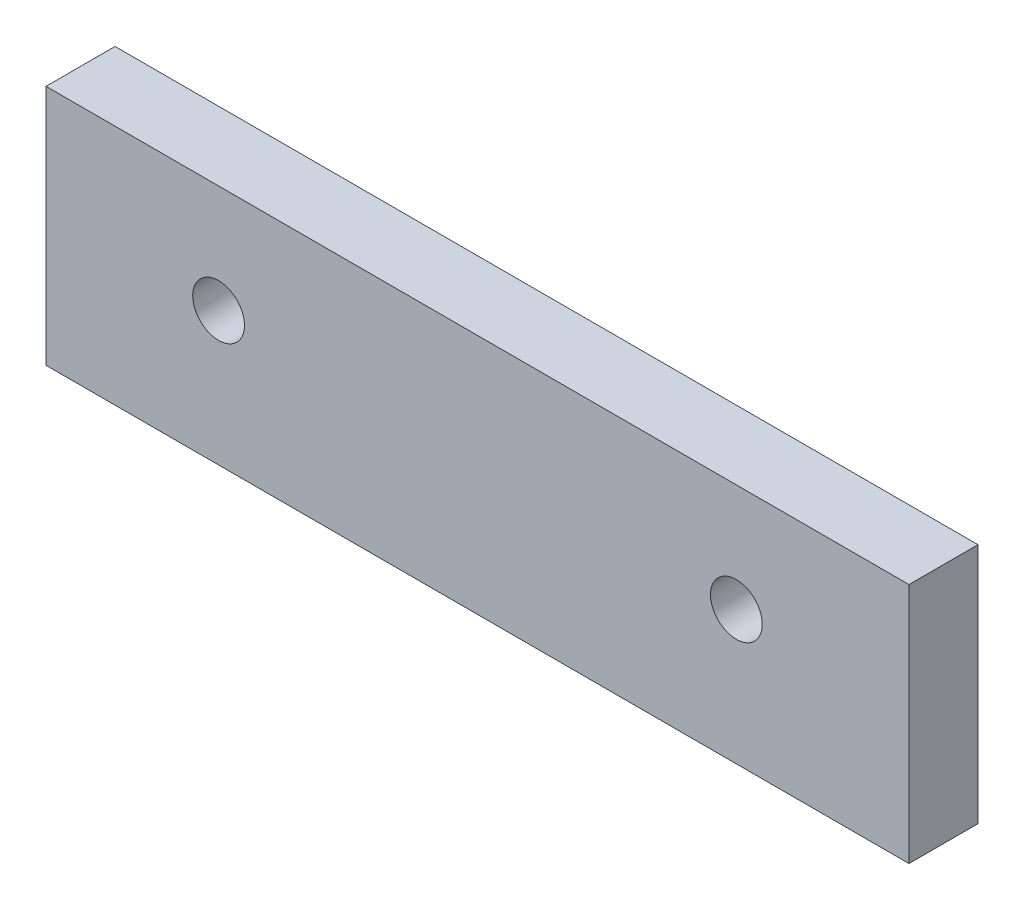
ISO-10303-21;
HEADER;
FILE_DESCRIPTION(('STEP AP214'),'2;1');
FILE_NAME('part.step','',(''),(''),'','','');
FILE_SCHEMA(('AUTOMOTIVE_DESIGN { 1 0 10303 214 1 1 1 1 }'));
ENDSEC;
DATA;
#1=APPLICATION_CONTEXT('core data for automotive mechanical design processes');
#2=APPLICATION_PROTOCOL_DEFINITION('international standard','automotive_design',2000,#1);
#3=PRODUCT_CONTEXT('',#1,'mechanical');
#4=PRODUCT('Part','Part','',(#3));
#5=PRODUCT_RELATED_PRODUCT_CATEGORY('part','',(#4));
#6=PRODUCT_DEFINITION_FORMATION('','',#4);
#7=PRODUCT_DEFINITION_CONTEXT('part definition',#1,'design');
#8=PRODUCT_DEFINITION('design','',#6,#7);
#9=PRODUCT_DEFINITION_SHAPE('','',#8);
#10=(LENGTH_UNIT() NAMED_UNIT(*) SI_UNIT(.MILLI.,.METRE.));
#11=(NAMED_UNIT(*) PLANE_ANGLE_UNIT() SI_UNIT($,.RADIAN.));
#12=(NAMED_UNIT(*) SI_UNIT($,.STERADIAN.) SOLID_ANGLE_UNIT());
#13=UNCERTAINTY_MEASURE_WITH_UNIT(LENGTH_MEASURE(1.E-05),#10,'distance_accuracy_value','');
#14=(GEOMETRIC_REPRESENTATION_CONTEXT(3) GLOBAL_UNCERTAINTY_ASSIGNED_CONTEXT((#13)) GLOBAL_UNIT_ASSIGNED_CONTEXT((#10,
#11,#12)) REPRESENTATION_CONTEXT('',''));
#15=CARTESIAN_POINT('',(0.,0.,0.));
#16=DIRECTION('',(0.,0.,1.));
#17=DIRECTION('',(1.,0.,0.));
#18=AXIS2_PLACEMENT_3D('',#15,#16,#17);
#19=CARTESIAN_POINT('',(50.,14.,7.99999999999999));
#20=DIRECTION('',(-1.,0.,0.));
#21=DIRECTION('',(0.,0.,0.999999999999999));
#22=AXIS2_PLACEMENT_3D('',#19,#20,#21);
#23=PLANE('',#22);
#24=DIRECTION('',(0.,1.,0.));
#25=VECTOR('',#24,1.);
#26=CARTESIAN_POINT('',(50.,14.,0.));
#27=LINE('',#26,#25);
#28=CARTESIAN_POINT('',(50.,-14.,0.));
#29=VERTEX_POINT('',#28);
#30=CARTESIAN_POINT('',(50.,14.,0.));
#31=VERTEX_POINT('',#30);
#32=EDGE_CURVE('E121',#29,#31,#27,.T.);
#33=ORIENTED_EDGE('',*,*,#32,.T.);
#34=DIRECTION('',(0.,0.,-0.999999999999999));
#35=VECTOR('',#34,1.);
#36=CARTESIAN_POINT('',(50.,14.,7.99999999999999));
#37=LINE('',#36,#35);
#38=CARTESIAN_POINT('',(50.,14.,7.99999999999999));
#39=VERTEX_POINT('',#38);
#40=EDGE_CURVE('E13',#39,#31,#37,.T.);
#41=ORIENTED_EDGE('',*,*,#40,.F.);
#42=DIRECTION('',(0.,1.,0.));
#43=VECTOR('',#42,1.);
#44=CARTESIAN_POINT('',(50.,14.,7.99999999999999));
#45=LINE('',#44,#43);
#46=CARTESIAN_POINT('',(50.,-14.,7.99999999999999));
#47=VERTEX_POINT('',#46);
#48=EDGE_CURVE('E104',#47,#39,#45,.T.);
#49=ORIENTED_EDGE('',*,*,#48,.F.);
#50=DIRECTION('',(0.,0.,-0.999999999999999));
#51=VECTOR('',#50,1.);
#52=CARTESIAN_POINT('',(50.,-14.,7.99999999999999));
#53=LINE('',#52,#51);
#54=EDGE_CURVE('E117',#47,#29,#53,.T.);
#55=ORIENTED_EDGE('',*,*,#54,.T.);
#56=EDGE_LOOP('',(#33,#41,#49,#55));
#57=FACE_BOUND('',#56,.T.);
#58=ADVANCED_FACE('F52',(#57),#23,.F.);
#59=CARTESIAN_POINT('',(-50.,14.,7.99999999999998));
#60=DIRECTION('',(0.,-1.,0.));
#61=DIRECTION('',(0.,0.,-0.999999999999999));
#62=AXIS2_PLACEMENT_3D('',#59,#60,#61);
#63=PLANE('',#62);
#64=DIRECTION('',(-1.,0.,0.));
#65=VECTOR('',#64,1.);
#66=CARTESIAN_POINT('',(-50.,14.,0.));
#67=LINE('',#66,#65);
#68=CARTESIAN_POINT('',(-50.,14.,0.));
#69=VERTEX_POINT('',#68);
#70=EDGE_CURVE('E109',#31,#69,#67,.T.);
#71=ORIENTED_EDGE('',*,*,#70,.T.);
#72=DIRECTION('',(0.,0.,-0.999999999999999));
#73=VECTOR('',#72,1.);
#74=CARTESIAN_POINT('',(-50.,14.,7.99999999999998));
#75=LINE('',#74,#73);
#76=CARTESIAN_POINT('',(-50.,14.,7.99999999999998));
#77=VERTEX_POINT('',#76);
#78=EDGE_CURVE('E61',#77,#69,#75,.T.);
#79=ORIENTED_EDGE('',*,*,#78,.F.);
#80=DIRECTION('',(-1.,0.,0.));
#81=VECTOR('',#80,1.);
#82=CARTESIAN_POINT('',(-50.,14.,7.99999999999998));
#83=LINE('',#82,#81);
#84=EDGE_CURVE('E99',#39,#77,#83,.T.);
#85=ORIENTED_EDGE('',*,*,#84,.F.);
#86=ORIENTED_EDGE('',*,*,#40,.T.);
#87=EDGE_LOOP('',(#71,#79,#85,#86));
#88=FACE_BOUND('',#87,.T.);
#89=ADVANCED_FACE('F108',(#88),#63,.F.);
#90=CARTESIAN_POINT('',(-50.,14.,7.99999999999998));
#91=DIRECTION('',(1.,0.,0.));
#92=DIRECTION('',(0.,0.,-0.999999999999999));
#93=AXIS2_PLACEMENT_3D('',#90,#91,#92);
#94=PLANE('',#93);
#95=DIRECTION('',(0.,-1.,0.));
#96=VECTOR('',#95,1.);
#97=CARTESIAN_POINT('',(-50.,14.,0.));
#98=LINE('',#97,#96);
#99=CARTESIAN_POINT('',(-50.,-14.,0.));
#100=VERTEX_POINT('',#99);
#101=EDGE_CURVE('E86',#69,#100,#98,.T.);
#102=ORIENTED_EDGE('',*,*,#101,.T.);
#103=DIRECTION('',(0.,0.,-0.999999999999999));
#104=VECTOR('',#103,1.);
#105=CARTESIAN_POINT('',(-50.,-14.,7.99999999999999));
#106=LINE('',#105,#104);
#107=CARTESIAN_POINT('',(-50.,-14.,7.99999999999999));
#108=VERTEX_POINT('',#107);
#109=EDGE_CURVE('E111',#108,#100,#106,.T.);
#110=ORIENTED_EDGE('',*,*,#109,.F.);
#111=DIRECTION('',(0.,-1.,0.));
#112=VECTOR('',#111,1.);
#113=CARTESIAN_POINT('',(-50.,14.,7.99999999999998));
#114=LINE('',#113,#112);
#115=EDGE_CURVE('E102',#77,#108,#114,.T.);
#116=ORIENTED_EDGE('',*,*,#115,.F.);
#117=ORIENTED_EDGE('',*,*,#78,.T.);
#118=EDGE_LOOP('',(#102,#110,#116,#117));
#119=FACE_BOUND('',#118,.T.);
#120=ADVANCED_FACE('F112',(#119),#94,.F.);
#121=CARTESIAN_POINT('',(-50.,-14.,7.99999999999999));
#122=DIRECTION('',(0.,1.,0.));
#123=DIRECTION('',(0.,0.,0.999999999999999));
#124=AXIS2_PLACEMENT_3D('',#121,#122,#123);
#125=PLANE('',#124);
#126=DIRECTION('',(1.,0.,0.));
#127=VECTOR('',#126,1.);
#128=CARTESIAN_POINT('',(-50.,-14.,0.));
#129=LINE('',#128,#127);
#130=EDGE_CURVE('E92',#100,#29,#129,.T.);
#131=ORIENTED_EDGE('',*,*,#130,.T.);
#132=ORIENTED_EDGE('',*,*,#54,.F.);
#133=DIRECTION('',(1.,0.,0.));
#134=VECTOR('',#133,1.);
#135=CARTESIAN_POINT('',(-50.,-14.,7.99999999999999));
#136=LINE('',#135,#134);
#137=EDGE_CURVE('E69',#108,#47,#136,.T.);
#138=ORIENTED_EDGE('',*,*,#137,.F.);
#139=ORIENTED_EDGE('',*,*,#109,.T.);
#140=EDGE_LOOP('',(#131,#132,#138,#139));
#141=FACE_BOUND('',#140,.T.);
#142=ADVANCED_FACE('F136',(#141),#125,.F.);
#143=CARTESIAN_POINT('',(0.,0.,7.99999999999999));
#144=DIRECTION('',(0.,0.,0.999999999999999));
#145=DIRECTION('',(1.,0.,0.));
#146=AXIS2_PLACEMENT_3D('',#143,#144,#145);
#147=PLANE('',#146);
#148=CARTESIAN_POINT('',(-30.,1.50000000000006,7.99999999999999));
#149=DIRECTION('',(0.,0.,-0.999999999999999));
#150=DIRECTION('',(-1.,0.,0.));
#151=AXIS2_PLACEMENT_3D('',#148,#149,#150);
#152=CIRCLE('',#151,3.);
#153=CARTESIAN_POINT('',(-33.,1.50000000000006,7.99999999999999));
#154=VERTEX_POINT('',#153);
#155=EDGE_CURVE('E155',#154,#154,#152,.T.);
#156=ORIENTED_EDGE('',*,*,#155,.T.);
#157=EDGE_LOOP('',(#156));
#158=FACE_BOUND('',#157,.T.);
#159=CARTESIAN_POINT('',(30.,1.50000000000006,7.99999999999999));
#160=DIRECTION('',(0.,0.,-0.999999999999999));
#161=DIRECTION('',(-1.,0.,0.));
#162=AXIS2_PLACEMENT_3D('',#159,#160,#161);
#163=CIRCLE('',#162,3.);
#164=CARTESIAN_POINT('',(27.,1.50000000000006,7.99999999999999));
#165=VERTEX_POINT('',#164);
#166=EDGE_CURVE('E125',#165,#165,#163,.T.);
#167=ORIENTED_EDGE('',*,*,#166,.T.);
#168=EDGE_LOOP('',(#167));
#169=FACE_BOUND('',#168,.T.);
#170=ORIENTED_EDGE('',*,*,#48,.T.);
#171=ORIENTED_EDGE('',*,*,#84,.T.);
#172=ORIENTED_EDGE('',*,*,#115,.T.);
#173=ORIENTED_EDGE('',*,*,#137,.T.);
#174=EDGE_LOOP('',(#170,#171,#172,#173));
#175=FACE_BOUND('',#174,.T.);
#176=ADVANCED_FACE('F100',(#158,#169,#175),#147,.T.);
#177=CARTESIAN_POINT('',(0.,0.,0.));
#178=DIRECTION('',(0.,0.,0.999999999999999));
#179=DIRECTION('',(1.,0.,0.));
#180=AXIS2_PLACEMENT_3D('',#177,#178,#179);
#181=PLANE('',#180);
#182=CARTESIAN_POINT('',(-30.,1.50000000000006,0.));
#183=DIRECTION('',(0.,0.,-0.999999999999999));
#184=DIRECTION('',(-1.,0.,0.));
#185=AXIS2_PLACEMENT_3D('',#182,#183,#184);
#186=CIRCLE('',#185,6.);
#187=CARTESIAN_POINT('',(-36.,1.50000000000006,0.));
#188=VERTEX_POINT('',#187);
#189=EDGE_CURVE('E163',#188,#188,#186,.T.);
#190=ORIENTED_EDGE('',*,*,#189,.F.);
#191=EDGE_LOOP('',(#190));
#192=FACE_BOUND('',#191,.T.);
#193=CARTESIAN_POINT('',(30.,1.50000000000006,0.));
#194=DIRECTION('',(0.,0.,-0.999999999999999));
#195=DIRECTION('',(-1.,0.,0.));
#196=AXIS2_PLACEMENT_3D('',#193,#194,#195);
#197=CIRCLE('',#196,6.);
#198=CARTESIAN_POINT('',(24.,1.50000000000006,0.));
#199=VERTEX_POINT('',#198);
#200=EDGE_CURVE('E151',#199,#199,#197,.T.);
#201=ORIENTED_EDGE('',*,*,#200,.F.);
#202=EDGE_LOOP('',(#201));
#203=FACE_BOUND('',#202,.T.);
#204=ORIENTED_EDGE('',*,*,#32,.F.);
#205=ORIENTED_EDGE('',*,*,#130,.F.);
#206=ORIENTED_EDGE('',*,*,#101,.F.);
#207=ORIENTED_EDGE('',*,*,#70,.F.);
#208=EDGE_LOOP('',(#204,#205,#206,#207));
#209=FACE_BOUND('',#208,.T.);
#210=ADVANCED_FACE('F139',(#192,#203,#209),#181,.F.);
#211=CARTESIAN_POINT('',(30.,1.50000000000006,0.));
#212=DIRECTION('',(0.,0.,-0.999999999999999));
#213=DIRECTION('',(-1.,0.,0.));
#214=AXIS2_PLACEMENT_3D('',#211,#212,#213);
#215=CYLINDRICAL_SURFACE('',#214,3.);
#216=CARTESIAN_POINT('',(30.,1.50000000000006,3.));
#217=DIRECTION('',(0.,0.,-0.999999999999999));
#218=DIRECTION('',(-1.,0.,0.));
#219=AXIS2_PLACEMENT_3D('',#216,#217,#218);
#220=CIRCLE('',#219,3.);
#221=CARTESIAN_POINT('',(27.,1.50000000000006,3.));
#222=VERTEX_POINT('',#221);
#223=EDGE_CURVE('E147',#222,#222,#220,.T.);
#224=CARTESIAN_POINT('',(27.,1.50000000000006,7.99999999999999));
#225=CARTESIAN_POINT('',(27.,1.50000000000006,7.94791666666666));
#226=CARTESIAN_POINT('',(27.,1.50000000000006,7.89583333333333));
#227=CARTESIAN_POINT('',(27.,1.50000000000006,7.79166666666666));
#228=CARTESIAN_POINT('',(27.,1.50000000000006,7.73958333333333));
#229=CARTESIAN_POINT('',(27.,1.50000000000006,7.63541666666666));
#230=CARTESIAN_POINT('',(27.,1.50000000000006,7.58333333333333));
#231=CARTESIAN_POINT('',(27.,1.50000000000006,7.47916666666666));
#232=CARTESIAN_POINT('',(27.,1.50000000000006,7.42708333333333));
#233=CARTESIAN_POINT('',(27.,1.50000000000006,7.32291666666666));
#234=CARTESIAN_POINT('',(27.,1.50000000000006,7.27083333333333));
#235=CARTESIAN_POINT('',(27.,1.50000000000006,7.16666666666666));
#236=CARTESIAN_POINT('',(27.,1.50000000000006,7.11458333333333));
#237=CARTESIAN_POINT('',(27.,1.50000000000006,7.01041666666666));
#238=CARTESIAN_POINT('',(27.,1.50000000000006,6.95833333333333));
#239=CARTESIAN_POINT('',(27.,1.50000000000006,6.85416666666666));
#240=CARTESIAN_POINT('',(27.,1.50000000000006,6.80208333333333));
#241=CARTESIAN_POINT('',(27.,1.50000000000006,6.69791666666666));
#242=CARTESIAN_POINT('',(27.,1.50000000000006,6.64583333333333));
#243=CARTESIAN_POINT('',(27.,1.50000000000006,6.54166666666666));
#244=CARTESIAN_POINT('',(27.,1.50000000000006,6.48958333333333));
#245=CARTESIAN_POINT('',(27.,1.50000000000006,6.38541666666666));
#246=CARTESIAN_POINT('',(27.,1.50000000000006,6.33333333333333));
#247=CARTESIAN_POINT('',(27.,1.50000000000006,6.22916666666666));
#248=CARTESIAN_POINT('',(27.,1.50000000000006,6.17708333333333));
#249=CARTESIAN_POINT('',(27.,1.50000000000006,6.07291666666666));
#250=CARTESIAN_POINT('',(27.,1.50000000000006,6.02083333333333));
#251=CARTESIAN_POINT('',(27.,1.50000000000006,5.91666666666666));
#252=CARTESIAN_POINT('',(27.,1.50000000000006,5.86458333333333));
#253=CARTESIAN_POINT('',(27.,1.50000000000006,5.76041666666666));
#254=CARTESIAN_POINT('',(27.,1.50000000000006,5.70833333333333));
#255=CARTESIAN_POINT('',(27.,1.50000000000006,5.60416666666666));
#256=CARTESIAN_POINT('',(27.,1.50000000000006,5.55208333333333));
#257=CARTESIAN_POINT('',(27.,1.50000000000006,5.44791666666667));
#258=CARTESIAN_POINT('',(27.,1.50000000000006,5.39583333333333));
#259=CARTESIAN_POINT('',(27.,1.50000000000006,5.29166666666667));
#260=CARTESIAN_POINT('',(27.,1.50000000000006,5.23958333333333));
#261=CARTESIAN_POINT('',(27.,1.50000000000006,5.13541666666667));
#262=CARTESIAN_POINT('',(27.,1.50000000000006,5.08333333333333));
#263=CARTESIAN_POINT('',(27.,1.50000000000006,4.97916666666667));
#264=CARTESIAN_POINT('',(27.,1.50000000000006,4.92708333333333));
#265=CARTESIAN_POINT('',(27.,1.50000000000006,4.82291666666667));
#266=CARTESIAN_POINT('',(27.,1.50000000000006,4.77083333333333));
#267=CARTESIAN_POINT('',(27.,1.50000000000006,4.66666666666667));
#268=CARTESIAN_POINT('',(27.,1.50000000000006,4.61458333333333));
#269=CARTESIAN_POINT('',(27.,1.50000000000006,4.51041666666667));
#270=CARTESIAN_POINT('',(27.,1.50000000000006,4.45833333333333));
#271=CARTESIAN_POINT('',(27.,1.50000000000006,4.35416666666667));
#272=CARTESIAN_POINT('',(27.,1.50000000000006,4.30208333333333));
#273=CARTESIAN_POINT('',(27.,1.50000000000006,4.19791666666667));
#274=CARTESIAN_POINT('',(27.,1.50000000000006,4.14583333333333));
#275=CARTESIAN_POINT('',(27.,1.50000000000006,4.04166666666667));
#276=CARTESIAN_POINT('',(27.,1.50000000000006,3.98958333333333));
#277=CARTESIAN_POINT('',(27.,1.50000000000006,3.88541666666667));
#278=CARTESIAN_POINT('',(27.,1.50000000000006,3.83333333333333));
#279=CARTESIAN_POINT('',(27.,1.50000000000006,3.72916666666667));
#280=CARTESIAN_POINT('',(27.,1.50000000000006,3.67708333333334));
#281=CARTESIAN_POINT('',(27.,1.50000000000006,3.57291666666667));
#282=CARTESIAN_POINT('',(27.,1.50000000000006,3.52083333333333));
#283=CARTESIAN_POINT('',(27.,1.50000000000006,3.41666666666667));
#284=CARTESIAN_POINT('',(27.,1.50000000000006,3.36458333333334));
#285=CARTESIAN_POINT('',(27.,1.50000000000006,3.26041666666667));
#286=CARTESIAN_POINT('',(27.,1.50000000000006,3.20833333333334));
#287=CARTESIAN_POINT('',(27.,1.50000000000006,3.10416666666667));
#288=CARTESIAN_POINT('',(27.,1.50000000000006,3.05208333333334));
#289=CARTESIAN_POINT('',(27.,1.50000000000006,3.));
#290=B_SPLINE_CURVE_WITH_KNOTS('',3,(#224,#225,#226,#227,#228,#229,#230,#231,#232,#233,#234,
#235,#236,#237,#238,#239,#240,#241,#242,#243,#244,#245,#246,#247,#248,#249,#250,#251,#252,#253,
#254,#255,#256,#257,#258,#259,#260,#261,#262,#263,#264,#265,#266,#267,#268,#269,#270,#271,#272,
#273,#274,#275,#276,#277,#278,#279,#280,#281,#282,#283,#284,#285,#286,#287,#288,#289),
.UNSPECIFIED.,.F.,.F.,(4,2,2,2,2,2,2,2,2,2,2,2,2,2,2,2,2,2,2,2,2,2,2,2,2,2,2,2,2,2,2,2,4),(0.,
0.15625,0.312499999999999,0.46875,0.624999999999999,0.781249999999999,0.937499999999998,1.09375,
1.25,1.40625,1.5625,1.71875,1.875,2.03125,2.1875,2.34375,2.5,2.65624999999999,2.81249999999999,
2.96874999999999,3.12499999999999,3.28124999999999,3.43749999999999,3.59374999999999,
3.74999999999999,3.90624999999999,4.06249999999999,4.21874999999999,4.37499999999999,
4.53124999999999,4.68749999999999,4.84374999999999,4.99999999999999),.UNSPECIFIED.);
#291=EDGE_CURVE('BSEAM173',#165,#222,#290,.T.);
#292=ORIENTED_EDGE('',*,*,#166,.F.);
#293=ORIENTED_EDGE('',*,*,#223,.T.);
#294=ORIENTED_EDGE('',*,*,#291,.T.);
#295=ORIENTED_EDGE('',*,*,#291,.F.);
#296=EDGE_LOOP('',(#292,#294,#293,#295));
#297=FACE_BOUND('',#296,.T.);
#298=ADVANCED_FACE('F173',(#297),#215,.F.);
#299=CARTESIAN_POINT('',(30.,1.50000000000006,0.));
#300=DIRECTION('',(0.,0.,-0.999999999999999));
#301=DIRECTION('',(-1.,0.,0.));
#302=AXIS2_PLACEMENT_3D('',#299,#300,#301);
#303=CONICAL_SURFACE('',#302,6.,0.785398163397449);
#304=CARTESIAN_POINT('',(27.,1.50000000000006,3.));
#305=CARTESIAN_POINT('',(26.96875,1.50000000000006,2.96875));
#306=CARTESIAN_POINT('',(26.9375,1.50000000000006,2.9375));
#307=CARTESIAN_POINT('',(26.875,1.50000000000006,2.875));
#308=CARTESIAN_POINT('',(26.84375,1.50000000000006,2.84375));
#309=CARTESIAN_POINT('',(26.78125,1.50000000000006,2.78125));
#310=CARTESIAN_POINT('',(26.75,1.50000000000006,2.75));
#311=CARTESIAN_POINT('',(26.6875,1.50000000000006,2.6875));
#312=CARTESIAN_POINT('',(26.65625,1.50000000000006,2.65625));
#313=CARTESIAN_POINT('',(26.59375,1.50000000000006,2.59375));
#314=CARTESIAN_POINT('',(26.5625,1.50000000000006,2.5625));
#315=CARTESIAN_POINT('',(26.5,1.50000000000006,2.5));
#316=CARTESIAN_POINT('',(26.46875,1.50000000000006,2.46875));
#317=CARTESIAN_POINT('',(26.40625,1.50000000000006,2.40625));
#318=CARTESIAN_POINT('',(26.375,1.50000000000006,2.375));
#319=CARTESIAN_POINT('',(26.3125,1.50000000000006,2.3125));
#320=CARTESIAN_POINT('',(26.28125,1.50000000000006,2.28125));
#321=CARTESIAN_POINT('',(26.21875,1.50000000000006,2.21875));
#322=CARTESIAN_POINT('',(26.1875,1.50000000000006,2.1875));
#323=CARTESIAN_POINT('',(26.125,1.50000000000006,2.125));
#324=CARTESIAN_POINT('',(26.09375,1.50000000000006,2.09375));
#325=CARTESIAN_POINT('',(26.03125,1.50000000000006,2.03125));
#326=CARTESIAN_POINT('',(26.,1.50000000000006,2.));
#327=CARTESIAN_POINT('',(25.9375,1.50000000000006,1.9375));
#328=CARTESIAN_POINT('',(25.90625,1.50000000000006,1.90625));
#329=CARTESIAN_POINT('',(25.84375,1.50000000000006,1.84375));
#330=CARTESIAN_POINT('',(25.8125,1.50000000000006,1.8125));
#331=CARTESIAN_POINT('',(25.75,1.50000000000006,1.75));
#332=CARTESIAN_POINT('',(25.71875,1.50000000000006,1.71875));
#333=CARTESIAN_POINT('',(25.65625,1.50000000000006,1.65625));
#334=CARTESIAN_POINT('',(25.625,1.50000000000006,1.625));
#335=CARTESIAN_POINT('',(25.5625,1.50000000000006,1.5625));
#336=CARTESIAN_POINT('',(25.53125,1.50000000000006,1.53125));
#337=CARTESIAN_POINT('',(25.46875,1.50000000000006,1.46875));
#338=CARTESIAN_POINT('',(25.4375,1.50000000000006,1.4375));
#339=CARTESIAN_POINT('',(25.375,1.50000000000006,1.375));
#340=CARTESIAN_POINT('',(25.34375,1.50000000000006,1.34375));
#341=CARTESIAN_POINT('',(25.28125,1.50000000000006,1.28125));
#342=CARTESIAN_POINT('',(25.25,1.50000000000006,1.25));
#343=CARTESIAN_POINT('',(25.1875,1.50000000000006,1.1875));
#344=CARTESIAN_POINT('',(25.15625,1.50000000000006,1.15625));
#345=CARTESIAN_POINT('',(25.09375,1.50000000000006,1.09375));
#346=CARTESIAN_POINT('',(25.0625,1.50000000000006,1.0625));
#347=CARTESIAN_POINT('',(25.,1.50000000000006,1.));
#348=CARTESIAN_POINT('',(24.96875,1.50000000000006,0.968750000000001));
#349=CARTESIAN_POINT('',(24.90625,1.50000000000006,0.906250000000001));
#350=CARTESIAN_POINT('',(24.875,1.50000000000006,0.875000000000001));
#351=CARTESIAN_POINT('',(24.8125,1.50000000000006,0.8125));
#352=CARTESIAN_POINT('',(24.78125,1.50000000000006,0.781250000000001));
#353=CARTESIAN_POINT('',(24.71875,1.50000000000006,0.718750000000001));
#354=CARTESIAN_POINT('',(24.6875,1.50000000000006,0.687500000000001));
#355=CARTESIAN_POINT('',(24.625,1.50000000000006,0.625));
#356=CARTESIAN_POINT('',(24.59375,1.50000000000006,0.593750000000001));
#357=CARTESIAN_POINT('',(24.53125,1.50000000000006,0.531250000000001));
#358=CARTESIAN_POINT('',(24.5,1.50000000000006,0.500000000000001));
#359=CARTESIAN_POINT('',(24.4375,1.50000000000006,0.437500000000001));
#360=CARTESIAN_POINT('',(24.40625,1.50000000000006,0.40625));
#361=CARTESIAN_POINT('',(24.34375,1.50000000000006,0.34375));
#362=CARTESIAN_POINT('',(24.3125,1.50000000000006,0.3125));
#363=CARTESIAN_POINT('',(24.25,1.50000000000006,0.25));
#364=CARTESIAN_POINT('',(24.21875,1.50000000000006,0.21875));
#365=CARTESIAN_POINT('',(24.15625,1.50000000000006,0.15625));
#366=CARTESIAN_POINT('',(24.125,1.50000000000006,0.125));
#367=CARTESIAN_POINT('',(24.0625,1.50000000000006,0.0624999999999999));
#368=CARTESIAN_POINT('',(24.03125,1.50000000000006,0.0312499999999999));
#369=CARTESIAN_POINT('',(24.,1.50000000000006,0.));
#370=B_SPLINE_CURVE_WITH_KNOTS('',3,(#304,#305,#306,#307,#308,#309,#310,#311,#312,#313,#314,
#315,#316,#317,#318,#319,#320,#321,#322,#323,#324,#325,#326,#327,#328,#329,#330,#331,#332,#333,
#334,#335,#336,#337,#338,#339,#340,#341,#342,#343,#344,#345,#346,#347,#348,#349,#350,#351,#352,
#353,#354,#355,#356,#357,#358,#359,#360,#361,#362,#363,#364,#365,#366,#367,#368,#369),
.UNSPECIFIED.,.F.,.F.,(4,2,2,2,2,2,2,2,2,2,2,2,2,2,2,2,2,2,2,2,2,2,2,2,2,2,2,2,2,2,2,2,4),(0.,
0.132582521472478,0.265165042944956,0.397747564417436,0.530330085889911,0.662912607362392,
0.795495128834869,0.928077650307347,1.06066017177982,1.1932426932523,1.32582521472478,
1.45840773619726,1.59099025766974,1.72357277914221,1.85615530061469,1.98873782208717,
2.12132034355965,2.25390286503213,2.3864853865046,2.51906790797708,2.65165042944956,
2.78423295092204,2.91681547239452,3.04939799386699,3.18198051533947,3.31456303681195,
3.44714555828443,3.5797280797569,3.71231060122938,3.84489312270186,3.97747564417434,
4.11005816564682,4.24264068711929),.UNSPECIFIED.);
#371=EDGE_CURVE('BSEAM177',#222,#199,#370,.T.);
#372=ORIENTED_EDGE('',*,*,#223,.F.);
#373=ORIENTED_EDGE('',*,*,#200,.T.);
#374=ORIENTED_EDGE('',*,*,#371,.T.);
#375=ORIENTED_EDGE('',*,*,#371,.F.);
#376=EDGE_LOOP('',(#372,#374,#373,#375));
#377=FACE_BOUND('',#376,.T.);
#378=ADVANCED_FACE('F177',(#377),#303,.F.);
#379=CARTESIAN_POINT('',(-30.,1.50000000000006,0.));
#380=DIRECTION('',(0.,0.,-0.999999999999999));
#381=DIRECTION('',(-1.,0.,0.));
#382=AXIS2_PLACEMENT_3D('',#379,#380,#381);
#383=CYLINDRICAL_SURFACE('',#382,3.);
#384=CARTESIAN_POINT('',(-30.,1.50000000000006,3.));
#385=DIRECTION('',(0.,0.,-0.999999999999999));
#386=DIRECTION('',(-1.,0.,0.));
#387=AXIS2_PLACEMENT_3D('',#384,#385,#386);
#388=CIRCLE('',#387,3.);
#389=CARTESIAN_POINT('',(-33.,1.50000000000006,3.));
#390=VERTEX_POINT('',#389);
#391=EDGE_CURVE('E159',#390,#390,#388,.T.);
#392=CARTESIAN_POINT('',(-33.,1.50000000000006,7.99999999999999));
#393=CARTESIAN_POINT('',(-33.,1.50000000000006,7.94791666666666));
#394=CARTESIAN_POINT('',(-33.,1.50000000000006,7.89583333333333));
#395=CARTESIAN_POINT('',(-33.,1.50000000000006,7.79166666666666));
#396=CARTESIAN_POINT('',(-33.,1.50000000000006,7.73958333333333));
#397=CARTESIAN_POINT('',(-33.,1.50000000000006,7.63541666666666));
#398=CARTESIAN_POINT('',(-33.,1.50000000000006,7.58333333333333));
#399=CARTESIAN_POINT('',(-33.,1.50000000000006,7.47916666666666));
#400=CARTESIAN_POINT('',(-33.,1.50000000000006,7.42708333333333));
#401=CARTESIAN_POINT('',(-33.,1.50000000000006,7.32291666666666));
#402=CARTESIAN_POINT('',(-33.,1.50000000000006,7.27083333333333));
#403=CARTESIAN_POINT('',(-33.,1.50000000000006,7.16666666666666));
#404=CARTESIAN_POINT('',(-33.,1.50000000000006,7.11458333333333));
#405=CARTESIAN_POINT('',(-33.,1.50000000000006,7.01041666666666));
#406=CARTESIAN_POINT('',(-33.,1.50000000000006,6.95833333333333));
#407=CARTESIAN_POINT('',(-33.,1.50000000000006,6.85416666666666));
#408=CARTESIAN_POINT('',(-33.,1.50000000000006,6.80208333333333));
#409=CARTESIAN_POINT('',(-33.,1.50000000000006,6.69791666666666));
#410=CARTESIAN_POINT('',(-33.,1.50000000000006,6.64583333333333));
#411=CARTESIAN_POINT('',(-33.,1.50000000000006,6.54166666666666));
#412=CARTESIAN_POINT('',(-33.,1.50000000000006,6.48958333333333));
#413=CARTESIAN_POINT('',(-33.,1.50000000000006,6.38541666666666));
#414=CARTESIAN_POINT('',(-33.,1.50000000000006,6.33333333333333));
#415=CARTESIAN_POINT('',(-33.,1.50000000000006,6.22916666666666));
#416=CARTESIAN_POINT('',(-33.,1.50000000000006,6.17708333333333));
#417=CARTESIAN_POINT('',(-33.,1.50000000000006,6.07291666666666));
#418=CARTESIAN_POINT('',(-33.,1.50000000000006,6.02083333333333));
#419=CARTESIAN_POINT('',(-33.,1.50000000000006,5.91666666666666));
#420=CARTESIAN_POINT('',(-33.,1.50000000000006,5.86458333333333));
#421=CARTESIAN_POINT('',(-33.,1.50000000000006,5.76041666666666));
#422=CARTESIAN_POINT('',(-33.,1.50000000000006,5.70833333333333));
#423=CARTESIAN_POINT('',(-33.,1.50000000000006,5.60416666666666));
#424=CARTESIAN_POINT('',(-33.,1.50000000000006,5.55208333333333));
#425=CARTESIAN_POINT('',(-33.,1.50000000000006,5.44791666666667));
#426=CARTESIAN_POINT('',(-33.,1.50000000000006,5.39583333333333));
#427=CARTESIAN_POINT('',(-33.,1.50000000000006,5.29166666666667));
#428=CARTESIAN_POINT('',(-33.,1.50000000000006,5.23958333333333));
#429=CARTESIAN_POINT('',(-33.,1.50000000000006,5.13541666666667));
#430=CARTESIAN_POINT('',(-33.,1.50000000000006,5.08333333333333));
#431=CARTESIAN_POINT('',(-33.,1.50000000000006,4.97916666666667));
#432=CARTESIAN_POINT('',(-33.,1.50000000000006,4.92708333333333));
#433=CARTESIAN_POINT('',(-33.,1.50000000000006,4.82291666666667));
#434=CARTESIAN_POINT('',(-33.,1.50000000000006,4.77083333333333));
#435=CARTESIAN_POINT('',(-33.,1.50000000000006,4.66666666666667));
#436=CARTESIAN_POINT('',(-33.,1.50000000000006,4.61458333333333));
#437=CARTESIAN_POINT('',(-33.,1.50000000000006,4.51041666666667));
#438=CARTESIAN_POINT('',(-33.,1.50000000000006,4.45833333333333));
#439=CARTESIAN_POINT('',(-33.,1.50000000000006,4.35416666666667));
#440=CARTESIAN_POINT('',(-33.,1.50000000000006,4.30208333333333));
#441=CARTESIAN_POINT('',(-33.,1.50000000000006,4.19791666666667));
#442=CARTESIAN_POINT('',(-33.,1.50000000000006,4.14583333333333));
#443=CARTESIAN_POINT('',(-33.,1.50000000000006,4.04166666666667));
#444=CARTESIAN_POINT('',(-33.,1.50000000000006,3.98958333333333));
#445=CARTESIAN_POINT('',(-33.,1.50000000000006,3.88541666666667));
#446=CARTESIAN_POINT('',(-33.,1.50000000000006,3.83333333333333));
#447=CARTESIAN_POINT('',(-33.,1.50000000000006,3.72916666666667));
#448=CARTESIAN_POINT('',(-33.,1.50000000000006,3.67708333333334));
#449=CARTESIAN_POINT('',(-33.,1.50000000000006,3.57291666666667));
#450=CARTESIAN_POINT('',(-33.,1.50000000000006,3.52083333333333));
#451=CARTESIAN_POINT('',(-33.,1.50000000000006,3.41666666666667));
#452=CARTESIAN_POINT('',(-33.,1.50000000000006,3.36458333333334));
#453=CARTESIAN_POINT('',(-33.,1.50000000000006,3.26041666666667));
#454=CARTESIAN_POINT('',(-33.,1.50000000000006,3.20833333333334));
#455=CARTESIAN_POINT('',(-33.,1.50000000000006,3.10416666666667));
#456=CARTESIAN_POINT('',(-33.,1.50000000000006,3.05208333333334));
#457=CARTESIAN_POINT('',(-33.,1.50000000000006,3.));
#458=B_SPLINE_CURVE_WITH_KNOTS('',3,(#392,#393,#394,#395,#396,#397,#398,#399,#400,#401,#402,
#403,#404,#405,#406,#407,#408,#409,#410,#411,#412,#413,#414,#415,#416,#417,#418,#419,#420,#421,
#422,#423,#424,#425,#426,#427,#428,#429,#430,#431,#432,#433,#434,#435,#436,#437,#438,#439,#440,
#441,#442,#443,#444,#445,#446,#447,#448,#449,#450,#451,#452,#453,#454,#455,#456,#457),
.UNSPECIFIED.,.F.,.F.,(4,2,2,2,2,2,2,2,2,2,2,2,2,2,2,2,2,2,2,2,2,2,2,2,2,2,2,2,2,2,2,2,4),(0.,
0.15625,0.312499999999999,0.46875,0.624999999999999,0.781249999999999,0.937499999999998,1.09375,
1.25,1.40625,1.5625,1.71875,1.875,2.03125,2.1875,2.34375,2.5,2.65624999999999,2.81249999999999,
2.96874999999999,3.12499999999999,3.28124999999999,3.43749999999999,3.59374999999999,
3.74999999999999,3.90624999999999,4.06249999999999,4.21874999999999,4.37499999999999,
4.53124999999999,4.68749999999999,4.84374999999999,4.99999999999999),.UNSPECIFIED.);
#459=EDGE_CURVE('BSEAM179',#154,#390,#458,.T.);
#460=ORIENTED_EDGE('',*,*,#155,.F.);
#461=ORIENTED_EDGE('',*,*,#391,.T.);
#462=ORIENTED_EDGE('',*,*,#459,.T.);
#463=ORIENTED_EDGE('',*,*,#459,.F.);
#464=EDGE_LOOP('',(#460,#462,#461,#463));
#465=FACE_BOUND('',#464,.T.);
#466=ADVANCED_FACE('F179',(#465),#383,.F.);
#467=CARTESIAN_POINT('',(-30.,1.50000000000006,0.));
#468=DIRECTION('',(0.,0.,-0.999999999999999));
#469=DIRECTION('',(-1.,0.,0.));
#470=AXIS2_PLACEMENT_3D('',#467,#468,#469);
#471=CONICAL_SURFACE('',#470,6.,0.785398163397448);
#472=CARTESIAN_POINT('',(-33.,1.50000000000006,3.));
#473=CARTESIAN_POINT('',(-33.03125,1.50000000000006,2.96875));
#474=CARTESIAN_POINT('',(-33.0625,1.50000000000006,2.9375));
#475=CARTESIAN_POINT('',(-33.125,1.50000000000006,2.875));
#476=CARTESIAN_POINT('',(-33.15625,1.50000000000006,2.84375));
#477=CARTESIAN_POINT('',(-33.21875,1.50000000000006,2.78125));
#478=CARTESIAN_POINT('',(-33.25,1.50000000000006,2.75));
#479=CARTESIAN_POINT('',(-33.3125,1.50000000000006,2.6875));
#480=CARTESIAN_POINT('',(-33.34375,1.50000000000006,2.65625));
#481=CARTESIAN_POINT('',(-33.40625,1.50000000000006,2.59375));
#482=CARTESIAN_POINT('',(-33.4375,1.50000000000006,2.5625));
#483=CARTESIAN_POINT('',(-33.5,1.50000000000006,2.5));
#484=CARTESIAN_POINT('',(-33.53125,1.50000000000006,2.46875));
#485=CARTESIAN_POINT('',(-33.59375,1.50000000000006,2.40625));
#486=CARTESIAN_POINT('',(-33.625,1.50000000000006,2.375));
#487=CARTESIAN_POINT('',(-33.6875,1.50000000000006,2.3125));
#488=CARTESIAN_POINT('',(-33.71875,1.50000000000006,2.28125));
#489=CARTESIAN_POINT('',(-33.78125,1.50000000000006,2.21875));
#490=CARTESIAN_POINT('',(-33.8125,1.50000000000006,2.1875));
#491=CARTESIAN_POINT('',(-33.875,1.50000000000006,2.125));
#492=CARTESIAN_POINT('',(-33.90625,1.50000000000006,2.09375));
#493=CARTESIAN_POINT('',(-33.96875,1.50000000000006,2.03125));
#494=CARTESIAN_POINT('',(-34.,1.50000000000006,2.));
#495=CARTESIAN_POINT('',(-34.0625,1.50000000000006,1.9375));
#496=CARTESIAN_POINT('',(-34.09375,1.50000000000006,1.90625));
#497=CARTESIAN_POINT('',(-34.15625,1.50000000000006,1.84375));
#498=CARTESIAN_POINT('',(-34.1875,1.50000000000006,1.8125));
#499=CARTESIAN_POINT('',(-34.25,1.50000000000006,1.75));
#500=CARTESIAN_POINT('',(-34.28125,1.50000000000006,1.71875));
#501=CARTESIAN_POINT('',(-34.34375,1.50000000000006,1.65625));
#502=CARTESIAN_POINT('',(-34.375,1.50000000000006,1.625));
#503=CARTESIAN_POINT('',(-34.4375,1.50000000000006,1.5625));
#504=CARTESIAN_POINT('',(-34.46875,1.50000000000006,1.53125));
#505=CARTESIAN_POINT('',(-34.53125,1.50000000000006,1.46875));
#506=CARTESIAN_POINT('',(-34.5625,1.50000000000006,1.4375));
#507=CARTESIAN_POINT('',(-34.625,1.50000000000006,1.375));
#508=CARTESIAN_POINT('',(-34.65625,1.50000000000006,1.34375));
#509=CARTESIAN_POINT('',(-34.71875,1.50000000000006,1.28125));
#510=CARTESIAN_POINT('',(-34.75,1.50000000000006,1.25));
#511=CARTESIAN_POINT('',(-34.8125,1.50000000000006,1.1875));
#512=CARTESIAN_POINT('',(-34.84375,1.50000000000006,1.15625));
#513=CARTESIAN_POINT('',(-34.90625,1.50000000000006,1.09375));
#514=CARTESIAN_POINT('',(-34.9375,1.50000000000006,1.0625));
#515=CARTESIAN_POINT('',(-35.,1.50000000000006,1.));
#516=CARTESIAN_POINT('',(-35.03125,1.50000000000006,0.968750000000001));
#517=CARTESIAN_POINT('',(-35.09375,1.50000000000006,0.906250000000001));
#518=CARTESIAN_POINT('',(-35.125,1.50000000000006,0.875));
#519=CARTESIAN_POINT('',(-35.1875,1.50000000000006,0.8125));
#520=CARTESIAN_POINT('',(-35.21875,1.50000000000006,0.781250000000001));
#521=CARTESIAN_POINT('',(-35.28125,1.50000000000006,0.718750000000001));
#522=CARTESIAN_POINT('',(-35.3125,1.50000000000006,0.6875));
#523=CARTESIAN_POINT('',(-35.375,1.50000000000006,0.625));
#524=CARTESIAN_POINT('',(-35.40625,1.50000000000006,0.593750000000001));
#525=CARTESIAN_POINT('',(-35.46875,1.50000000000006,0.531250000000001));
#526=CARTESIAN_POINT('',(-35.5,1.50000000000006,0.5));
#527=CARTESIAN_POINT('',(-35.5625,1.50000000000006,0.4375));
#528=CARTESIAN_POINT('',(-35.59375,1.50000000000006,0.406250000000001));
#529=CARTESIAN_POINT('',(-35.65625,1.50000000000006,0.343750000000001));
#530=CARTESIAN_POINT('',(-35.6875,1.50000000000006,0.3125));
#531=CARTESIAN_POINT('',(-35.75,1.50000000000006,0.25));
#532=CARTESIAN_POINT('',(-35.78125,1.50000000000006,0.21875));
#533=CARTESIAN_POINT('',(-35.84375,1.50000000000006,0.156250000000001));
#534=CARTESIAN_POINT('',(-35.875,1.50000000000006,0.125000000000001));
#535=CARTESIAN_POINT('',(-35.9375,1.50000000000006,0.0625000000000006));
#536=CARTESIAN_POINT('',(-35.96875,1.50000000000006,0.0312500000000007));
#537=CARTESIAN_POINT('',(-36.,1.50000000000006,0.));
#538=B_SPLINE_CURVE_WITH_KNOTS('',3,(#472,#473,#474,#475,#476,#477,#478,#479,#480,#481,#482,
#483,#484,#485,#486,#487,#488,#489,#490,#491,#492,#493,#494,#495,#496,#497,#498,#499,#500,#501,
#502,#503,#504,#505,#506,#507,#508,#509,#510,#511,#512,#513,#514,#515,#516,#517,#518,#519,#520,
#521,#522,#523,#524,#525,#526,#527,#528,#529,#530,#531,#532,#533,#534,#535,#536,#537),
.UNSPECIFIED.,.F.,.F.,(4,2,2,2,2,2,2,2,2,2,2,2,2,2,2,2,2,2,2,2,2,2,2,2,2,2,2,2,2,2,2,2,4),(0.,
0.132582521472475,0.265165042944956,0.397747564417431,0.530330085889911,0.662912607362387,
0.795495128834867,0.928077650307342,1.06066017177982,1.1932426932523,1.32582521472478,
1.45840773619725,1.59099025766973,1.72357277914221,1.85615530061469,1.98873782208716,
2.12132034355965,2.25390286503212,2.3864853865046,2.51906790797708,2.65165042944956,
2.78423295092203,2.91681547239451,3.04939799386699,3.18198051533947,3.31456303681194,
3.44714555828442,3.5797280797569,3.71231060122938,3.84489312270185,3.97747564417433,
4.11005816564682,4.24264068711929),.UNSPECIFIED.);
#539=EDGE_CURVE('BSEAM169',#390,#188,#538,.T.);
#540=ORIENTED_EDGE('',*,*,#391,.F.);
#541=ORIENTED_EDGE('',*,*,#189,.T.);
#542=ORIENTED_EDGE('',*,*,#539,.T.);
#543=ORIENTED_EDGE('',*,*,#539,.F.);
#544=EDGE_LOOP('',(#540,#542,#541,#543));
#545=FACE_BOUND('',#544,.T.);
#546=ADVANCED_FACE('F169',(#545),#471,.F.);
#547=CLOSED_SHELL('',(#58,#89,#120,#142,#176,#210,#298,#378,#466,#546));
#548=MANIFOLD_SOLID_BREP('B2',#547);
#549=ADVANCED_BREP_SHAPE_REPRESENTATION('',(#18,#548),#14);
#550=SHAPE_DEFINITION_REPRESENTATION(#9,#549);
ENDSEC;
END-ISO-10303-21;
